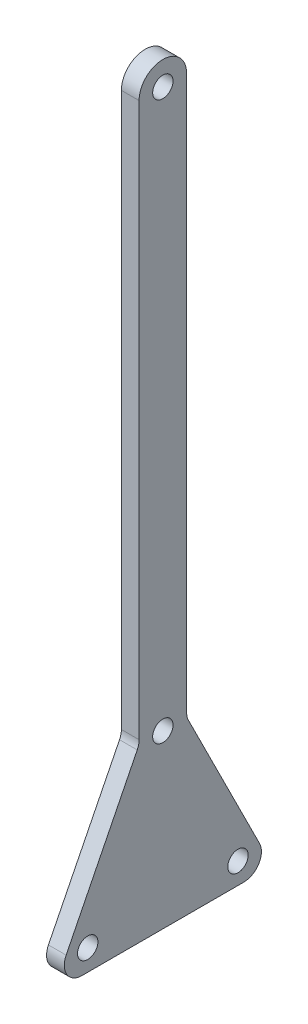
ISO-10303-21;
HEADER;
FILE_DESCRIPTION(('STEP AP214'),'2;1');
FILE_NAME('part.step','',(''),(''),'','','');
FILE_SCHEMA(('AUTOMOTIVE_DESIGN { 1 0 10303 214 1 1 1 1 }'));
ENDSEC;
DATA;
#1=APPLICATION_CONTEXT('core data for automotive mechanical design processes');
#2=APPLICATION_PROTOCOL_DEFINITION('international standard','automotive_design',2000,#1);
#3=PRODUCT_CONTEXT('',#1,'mechanical');
#4=PRODUCT('Part','Part','',(#3));
#5=PRODUCT_RELATED_PRODUCT_CATEGORY('part','',(#4));
#6=PRODUCT_DEFINITION_FORMATION('','',#4);
#7=PRODUCT_DEFINITION_CONTEXT('part definition',#1,'design');
#8=PRODUCT_DEFINITION('design','',#6,#7);
#9=PRODUCT_DEFINITION_SHAPE('','',#8);
#10=(LENGTH_UNIT() NAMED_UNIT(*) SI_UNIT(.MILLI.,.METRE.));
#11=(NAMED_UNIT(*) PLANE_ANGLE_UNIT() SI_UNIT($,.RADIAN.));
#12=(NAMED_UNIT(*) SI_UNIT($,.STERADIAN.) SOLID_ANGLE_UNIT());
#13=UNCERTAINTY_MEASURE_WITH_UNIT(LENGTH_MEASURE(1.E-05),#10,'distance_accuracy_value','');
#14=(GEOMETRIC_REPRESENTATION_CONTEXT(3) GLOBAL_UNCERTAINTY_ASSIGNED_CONTEXT((#13)) GLOBAL_UNIT_ASSIGNED_CONTEXT((#10,
#11,#12)) REPRESENTATION_CONTEXT('',''));
#15=CARTESIAN_POINT('',(0.,0.,0.));
#16=DIRECTION('',(0.,0.,1.));
#17=DIRECTION('',(1.,0.,0.));
#18=AXIS2_PLACEMENT_3D('',#15,#16,#17);
#19=CARTESIAN_POINT('',(3.175,7.09376379885484,-14.1875275977097));
#20=DIRECTION('',(0.,0.447213595499958,-0.894427190999916));
#21=DIRECTION('',(0.,0.894427190999916,0.447213595499958));
#22=AXIS2_PLACEMENT_3D('',#19,#20,#21);
#23=PLANE('',#22);
#24=DIRECTION('',(0.,-0.894427190999916,-0.447213595499958));
#25=VECTOR('',#24,1.);
#26=CARTESIAN_POINT('',(0.,7.09376379885484,-14.1875275977097));
#27=LINE('',#26,#25);
#28=CARTESIAN_POINT('',(0.,26.2790126628495,-4.59490316571237));
#29=VERTEX_POINT('',#28);
#30=CARTESIAN_POINT('',(0.,0.784903165712368,-17.3419579142809));
#31=VERTEX_POINT('',#30);
#32=EDGE_CURVE('E203',#29,#31,#27,.T.);
#33=ORIENTED_EDGE('',*,*,#32,.F.);
#34=DIRECTION('',(-1.,0.,0.));
#35=VECTOR('',#34,1.);
#36=CARTESIAN_POINT('',(3.175,26.2790126628495,-4.59490316571237));
#37=LINE('',#36,#35);
#38=CARTESIAN_POINT('',(3.175,26.2790126628495,-4.59490316571237));
#39=VERTEX_POINT('',#38);
#40=EDGE_CURVE('E257',#29,#39,#37,.F.);
#41=ORIENTED_EDGE('',*,*,#40,.T.);
#42=DIRECTION('',(0.,-0.894427190999916,-0.447213595499958));
#43=VECTOR('',#42,1.);
#44=CARTESIAN_POINT('',(3.175,7.09376379885484,-14.1875275977097));
#45=LINE('',#44,#43);
#46=CARTESIAN_POINT('',(3.175,0.784903165712368,-17.3419579142809));
#47=VERTEX_POINT('',#46);
#48=EDGE_CURVE('E170',#39,#47,#45,.T.);
#49=ORIENTED_EDGE('',*,*,#48,.T.);
#50=DIRECTION('',(-1.,0.,0.));
#51=VECTOR('',#50,1.);
#52=CARTESIAN_POINT('',(3.175,0.784903165712367,-17.3419579142809));
#53=LINE('',#52,#51);
#54=EDGE_CURVE('E253',#47,#31,#53,.T.);
#55=ORIENTED_EDGE('',*,*,#54,.T.);
#56=EDGE_LOOP('',(#33,#41,#49,#55));
#57=FACE_BOUND('',#56,.T.);
#58=ADVANCED_FACE('F42',(#57),#23,.T.);
#59=CARTESIAN_POINT('',(3.175,0.,-4.2597094971371));
#60=DIRECTION('',(0.,0.,-1.));
#61=DIRECTION('',(-1.,0.,0.));
#62=AXIS2_PLACEMENT_3D('',#59,#60,#61);
#63=PLANE('',#62);
#64=DIRECTION('',(0.,-1.,0.));
#65=VECTOR('',#64,1.);
#66=CARTESIAN_POINT('',(3.175,0.,-4.2597094971371));
#67=LINE('',#66,#65);
#68=CARTESIAN_POINT('',(3.175,126.9494,-4.2597094971371));
#69=VERTEX_POINT('',#68);
#70=CARTESIAN_POINT('',(3.175,27.6989158285618,-4.2597094971371));
#71=VERTEX_POINT('',#70);
#72=EDGE_CURVE('E146',#69,#71,#67,.T.);
#73=ORIENTED_EDGE('',*,*,#72,.T.);
#74=DIRECTION('',(-1.,0.,0.));
#75=VECTOR('',#74,1.);
#76=CARTESIAN_POINT('',(0.,27.6989158285618,-4.2597094971371));
#77=LINE('',#76,#75);
#78=CARTESIAN_POINT('',(0.,27.6989158285618,-4.2597094971371));
#79=VERTEX_POINT('',#78);
#80=EDGE_CURVE('E250',#71,#79,#77,.T.);
#81=ORIENTED_EDGE('',*,*,#80,.T.);
#82=DIRECTION('',(0.,-1.,0.));
#83=VECTOR('',#82,1.);
#84=CARTESIAN_POINT('',(0.,0.,-4.2597094971371));
#85=LINE('',#84,#83);
#86=CARTESIAN_POINT('',(0.,126.9494,-4.2597094971371));
#87=VERTEX_POINT('',#86);
#88=EDGE_CURVE('E149',#87,#79,#85,.T.);
#89=ORIENTED_EDGE('',*,*,#88,.F.);
#90=DIRECTION('',(-1.,0.,0.));
#91=VECTOR('',#90,1.);
#92=CARTESIAN_POINT('',(3.175,126.9494,-4.2597094971371));
#93=LINE('',#92,#91);
#94=EDGE_CURVE('E141',#69,#87,#93,.T.);
#95=ORIENTED_EDGE('',*,*,#94,.F.);
#96=EDGE_LOOP('',(#73,#81,#89,#95));
#97=FACE_BOUND('',#96,.T.);
#98=ADVANCED_FACE('F143',(#97),#63,.T.);
#99=CARTESIAN_POINT('',(3.175,126.9494,0.));
#100=DIRECTION('',(-1.,0.,0.));
#101=DIRECTION('',(0.,0.,1.));
#102=AXIS2_PLACEMENT_3D('',#99,#100,#101);
#103=CYLINDRICAL_SURFACE('',#102,4.2597094971371);
#104=CARTESIAN_POINT('',(0.,126.9494,0.));
#105=DIRECTION('',(1.,0.,0.));
#106=DIRECTION('',(0.,0.,-1.));
#107=AXIS2_PLACEMENT_3D('',#104,#105,#106);
#108=CIRCLE('',#107,4.2597094971371);
#109=CARTESIAN_POINT('',(0.,126.9494,4.2597094971371));
#110=VERTEX_POINT('',#109);
#111=EDGE_CURVE('E209',#87,#110,#108,.T.);
#112=ORIENTED_EDGE('',*,*,#111,.T.);
#113=DIRECTION('',(-1.,0.,0.));
#114=VECTOR('',#113,1.);
#115=CARTESIAN_POINT('',(3.175,126.9494,4.2597094971371));
#116=LINE('',#115,#114);
#117=CARTESIAN_POINT('',(3.175,126.9494,4.2597094971371));
#118=VERTEX_POINT('',#117);
#119=EDGE_CURVE('E154',#118,#110,#116,.T.);
#120=ORIENTED_EDGE('',*,*,#119,.F.);
#121=CARTESIAN_POINT('',(3.175,126.9494,0.));
#122=DIRECTION('',(1.,0.,0.));
#123=DIRECTION('',(0.,0.,-1.));
#124=AXIS2_PLACEMENT_3D('',#121,#122,#123);
#125=CIRCLE('',#124,4.2597094971371);
#126=EDGE_CURVE('E157',#69,#118,#125,.T.);
#127=ORIENTED_EDGE('',*,*,#126,.F.);
#128=ORIENTED_EDGE('',*,*,#94,.T.);
#129=EDGE_LOOP('',(#112,#120,#127,#128));
#130=FACE_BOUND('',#129,.T.);
#131=ADVANCED_FACE('F158',(#130),#103,.T.);
#132=CARTESIAN_POINT('',(3.175,0.,4.2597094971371));
#133=DIRECTION('',(0.,0.,-1.));
#134=DIRECTION('',(-1.,0.,0.));
#135=AXIS2_PLACEMENT_3D('',#132,#133,#134);
#136=PLANE('',#135);
#137=DIRECTION('',(0.,-1.,0.));
#138=VECTOR('',#137,1.);
#139=CARTESIAN_POINT('',(0.,0.,4.2597094971371));
#140=LINE('',#139,#138);
#141=CARTESIAN_POINT('',(0.,27.6989158285618,4.2597094971371));
#142=VERTEX_POINT('',#141);
#143=EDGE_CURVE('E212',#110,#142,#140,.T.);
#144=ORIENTED_EDGE('',*,*,#143,.T.);
#145=DIRECTION('',(-1.,0.,0.));
#146=VECTOR('',#145,1.);
#147=CARTESIAN_POINT('',(3.175,27.6989158285618,4.2597094971371));
#148=LINE('',#147,#146);
#149=CARTESIAN_POINT('',(3.175,27.6989158285618,4.2597094971371));
#150=VERTEX_POINT('',#149);
#151=EDGE_CURVE('E247',#142,#150,#148,.F.);
#152=ORIENTED_EDGE('',*,*,#151,.T.);
#153=DIRECTION('',(0.,-1.,0.));
#154=VECTOR('',#153,1.);
#155=CARTESIAN_POINT('',(3.175,0.,4.2597094971371));
#156=LINE('',#155,#154);
#157=EDGE_CURVE('E163',#118,#150,#156,.T.);
#158=ORIENTED_EDGE('',*,*,#157,.F.);
#159=ORIENTED_EDGE('',*,*,#119,.T.);
#160=EDGE_LOOP('',(#144,#152,#158,#159));
#161=FACE_BOUND('',#160,.T.);
#162=ADVANCED_FACE('F312',(#161),#136,.F.);
#163=CARTESIAN_POINT('',(3.175,7.09376379885484,14.1875275977097));
#164=DIRECTION('',(0.,0.447213595499958,0.894427190999916));
#165=DIRECTION('',(0.,-0.894427190999916,0.447213595499958));
#166=AXIS2_PLACEMENT_3D('',#163,#164,#165);
#167=PLANE('',#166);
#168=DIRECTION('',(0.,0.894427190999916,-0.447213595499958));
#169=VECTOR('',#168,1.);
#170=CARTESIAN_POINT('',(3.175,7.09376379885484,14.1875275977097));
#171=LINE('',#170,#169);
#172=CARTESIAN_POINT('',(3.175,0.784903165712362,17.3419579142809));
#173=VERTEX_POINT('',#172);
#174=CARTESIAN_POINT('',(3.175,26.2790126628494,4.59490316571237));
#175=VERTEX_POINT('',#174);
#176=EDGE_CURVE('E181',#173,#175,#171,.T.);
#177=ORIENTED_EDGE('',*,*,#176,.T.);
#178=DIRECTION('',(-1.,0.,0.));
#179=VECTOR('',#178,1.);
#180=CARTESIAN_POINT('',(3.175,26.2790126628494,4.59490316571237));
#181=LINE('',#180,#179);
#182=CARTESIAN_POINT('',(0.,26.2790126628494,4.59490316571237));
#183=VERTEX_POINT('',#182);
#184=EDGE_CURVE('E243',#175,#183,#181,.T.);
#185=ORIENTED_EDGE('',*,*,#184,.T.);
#186=DIRECTION('',(0.,0.894427190999916,-0.447213595499958));
#187=VECTOR('',#186,1.);
#188=CARTESIAN_POINT('',(0.,7.09376379885484,14.1875275977097));
#189=LINE('',#188,#187);
#190=CARTESIAN_POINT('',(0.,0.784903165712362,17.3419579142809));
#191=VERTEX_POINT('',#190);
#192=EDGE_CURVE('E216',#191,#183,#189,.T.);
#193=ORIENTED_EDGE('',*,*,#192,.F.);
#194=DIRECTION('',(-1.,0.,0.));
#195=VECTOR('',#194,1.);
#196=CARTESIAN_POINT('',(3.175,0.784903165712362,17.3419579142809));
#197=LINE('',#196,#195);
#198=EDGE_CURVE('E153',#191,#173,#197,.F.);
#199=ORIENTED_EDGE('',*,*,#198,.T.);
#200=EDGE_LOOP('',(#177,#185,#193,#199));
#201=FACE_BOUND('',#200,.T.);
#202=ADVANCED_FACE('F315',(#201),#167,.T.);
#203=CARTESIAN_POINT('',(3.175,26.9494,0.));
#204=DIRECTION('',(-1.,0.,0.));
#205=DIRECTION('',(0.,0.,1.));
#206=AXIS2_PLACEMENT_3D('',#203,#204,#205);
#207=CYLINDRICAL_SURFACE('',#206,1.8288);
#208=CARTESIAN_POINT('',(3.175,26.9494,0.));
#209=DIRECTION('',(1.,0.,0.));
#210=DIRECTION('',(0.,0.,-1.));
#211=AXIS2_PLACEMENT_3D('',#208,#209,#210);
#212=CIRCLE('',#211,1.8288);
#213=CARTESIAN_POINT('',(3.175,26.9494,-1.8288));
#214=VERTEX_POINT('',#213);
#215=EDGE_CURVE('E196',#214,#214,#212,.T.);
#216=ORIENTED_EDGE('',*,*,#215,.T.);
#217=EDGE_LOOP('',(#216));
#218=FACE_BOUND('',#217,.T.);
#219=CARTESIAN_POINT('',(0.,26.9494,0.));
#220=DIRECTION('',(1.,0.,0.));
#221=DIRECTION('',(0.,0.,-1.));
#222=AXIS2_PLACEMENT_3D('',#219,#220,#221);
#223=CIRCLE('',#222,1.8288);
#224=CARTESIAN_POINT('',(0.,26.9494,-1.8288));
#225=VERTEX_POINT('',#224);
#226=EDGE_CURVE('E232',#225,#225,#223,.T.);
#227=ORIENTED_EDGE('',*,*,#226,.F.);
#228=EDGE_LOOP('',(#227));
#229=FACE_BOUND('',#228,.T.);
#230=ADVANCED_FACE('F319',(#218,#229),#207,.F.);
#231=CARTESIAN_POINT('',(3.175,0.,13.4747));
#232=DIRECTION('',(-1.,0.,0.));
#233=DIRECTION('',(0.,0.,1.));
#234=AXIS2_PLACEMENT_3D('',#231,#232,#233);
#235=CYLINDRICAL_SURFACE('',#234,1.8288);
#236=CARTESIAN_POINT('',(3.175,0.,13.4747));
#237=DIRECTION('',(1.,0.,0.));
#238=DIRECTION('',(0.,0.,-1.));
#239=AXIS2_PLACEMENT_3D('',#236,#237,#238);
#240=CIRCLE('',#239,1.8288);
#241=CARTESIAN_POINT('',(3.175,0.,11.6459));
#242=VERTEX_POINT('',#241);
#243=EDGE_CURVE('E192',#242,#242,#240,.T.);
#244=ORIENTED_EDGE('',*,*,#243,.T.);
#245=EDGE_LOOP('',(#244));
#246=FACE_BOUND('',#245,.T.);
#247=CARTESIAN_POINT('',(0.,0.,13.4747));
#248=DIRECTION('',(1.,0.,0.));
#249=DIRECTION('',(0.,0.,-1.));
#250=AXIS2_PLACEMENT_3D('',#247,#248,#249);
#251=CIRCLE('',#250,1.8288);
#252=CARTESIAN_POINT('',(0.,0.,11.6459));
#253=VERTEX_POINT('',#252);
#254=EDGE_CURVE('E228',#253,#253,#251,.T.);
#255=ORIENTED_EDGE('',*,*,#254,.F.);
#256=EDGE_LOOP('',(#255));
#257=FACE_BOUND('',#256,.T.);
#258=ADVANCED_FACE('F328',(#246,#257),#235,.F.);
#259=CARTESIAN_POINT('',(3.175,0.,-13.4747));
#260=DIRECTION('',(-1.,0.,0.));
#261=DIRECTION('',(0.,0.,1.));
#262=AXIS2_PLACEMENT_3D('',#259,#260,#261);
#263=CYLINDRICAL_SURFACE('',#262,1.8288);
#264=CARTESIAN_POINT('',(3.175,0.,-13.4747));
#265=DIRECTION('',(1.,0.,0.));
#266=DIRECTION('',(0.,0.,-1.));
#267=AXIS2_PLACEMENT_3D('',#264,#265,#266);
#268=CIRCLE('',#267,1.8288);
#269=CARTESIAN_POINT('',(3.175,0.,-15.3035));
#270=VERTEX_POINT('',#269);
#271=EDGE_CURVE('E188',#270,#270,#268,.T.);
#272=ORIENTED_EDGE('',*,*,#271,.T.);
#273=EDGE_LOOP('',(#272));
#274=FACE_BOUND('',#273,.T.);
#275=CARTESIAN_POINT('',(0.,0.,-13.4747));
#276=DIRECTION('',(1.,0.,0.));
#277=DIRECTION('',(0.,0.,-1.));
#278=AXIS2_PLACEMENT_3D('',#275,#276,#277);
#279=CIRCLE('',#278,1.8288);
#280=CARTESIAN_POINT('',(0.,0.,-15.3035));
#281=VERTEX_POINT('',#280);
#282=EDGE_CURVE('E224',#281,#281,#279,.T.);
#283=ORIENTED_EDGE('',*,*,#282,.F.);
#284=EDGE_LOOP('',(#283));
#285=FACE_BOUND('',#284,.T.);
#286=ADVANCED_FACE('F325',(#274,#285),#263,.F.);
#287=CARTESIAN_POINT('',(3.175,-3.81,0.));
#288=DIRECTION('',(0.,-1.,0.));
#289=DIRECTION('',(0.,0.,-1.));
#290=AXIS2_PLACEMENT_3D('',#287,#288,#289);
#291=PLANE('',#290);
#292=DIRECTION('',(0.,0.,1.));
#293=VECTOR('',#292,1.);
#294=CARTESIAN_POINT('',(0.,-3.81,0.));
#295=LINE('',#294,#293);
#296=CARTESIAN_POINT('',(0.,-3.81,-14.5021515828562));
#297=VERTEX_POINT('',#296);
#298=CARTESIAN_POINT('',(0.,-3.81,14.5021515828562));
#299=VERTEX_POINT('',#298);
#300=EDGE_CURVE('E220',#297,#299,#295,.T.);
#301=ORIENTED_EDGE('',*,*,#300,.F.);
#302=DIRECTION('',(-1.,0.,0.));
#303=VECTOR('',#302,1.);
#304=CARTESIAN_POINT('',(3.175,-3.81,-14.5021515828562));
#305=LINE('',#304,#303);
#306=CARTESIAN_POINT('',(3.175,-3.81,-14.5021515828562));
#307=VERTEX_POINT('',#306);
#308=EDGE_CURVE('E70',#297,#307,#305,.F.);
#309=ORIENTED_EDGE('',*,*,#308,.T.);
#310=DIRECTION('',(0.,0.,1.));
#311=VECTOR('',#310,1.);
#312=CARTESIAN_POINT('',(3.175,-3.81,0.));
#313=LINE('',#312,#311);
#314=CARTESIAN_POINT('',(3.175,-3.81,14.5021515828562));
#315=VERTEX_POINT('',#314);
#316=EDGE_CURVE('E185',#307,#315,#313,.T.);
#317=ORIENTED_EDGE('',*,*,#316,.T.);
#318=DIRECTION('',(-1.,0.,0.));
#319=VECTOR('',#318,1.);
#320=CARTESIAN_POINT('',(3.175,-3.81,14.5021515828562));
#321=LINE('',#320,#319);
#322=EDGE_CURVE('E266',#315,#299,#321,.T.);
#323=ORIENTED_EDGE('',*,*,#322,.T.);
#324=EDGE_LOOP('',(#301,#309,#317,#323));
#325=FACE_BOUND('',#324,.T.);
#326=ADVANCED_FACE('F321',(#325),#291,.T.);
#327=CARTESIAN_POINT('',(3.175,126.9494,0.));
#328=DIRECTION('',(-1.,0.,0.));
#329=DIRECTION('',(0.,0.,1.));
#330=AXIS2_PLACEMENT_3D('',#327,#328,#329);
#331=CYLINDRICAL_SURFACE('',#330,1.8288);
#332=CARTESIAN_POINT('',(3.175,126.9494,0.));
#333=DIRECTION('',(1.,0.,0.));
#334=DIRECTION('',(0.,0.,-1.));
#335=AXIS2_PLACEMENT_3D('',#332,#333,#334);
#336=CIRCLE('',#335,1.8288);
#337=CARTESIAN_POINT('',(3.175,126.9494,-1.8288));
#338=VERTEX_POINT('',#337);
#339=EDGE_CURVE('E199',#338,#338,#336,.T.);
#340=ORIENTED_EDGE('',*,*,#339,.T.);
#341=EDGE_LOOP('',(#340));
#342=FACE_BOUND('',#341,.T.);
#343=CARTESIAN_POINT('',(0.,126.9494,0.));
#344=DIRECTION('',(1.,0.,0.));
#345=DIRECTION('',(0.,0.,-1.));
#346=AXIS2_PLACEMENT_3D('',#343,#344,#345);
#347=CIRCLE('',#346,1.8288);
#348=CARTESIAN_POINT('',(0.,126.9494,-1.8288));
#349=VERTEX_POINT('',#348);
#350=EDGE_CURVE('E176',#349,#349,#347,.T.);
#351=ORIENTED_EDGE('',*,*,#350,.F.);
#352=EDGE_LOOP('',(#351));
#353=FACE_BOUND('',#352,.T.);
#354=ADVANCED_FACE('F324',(#342,#353),#331,.F.);
#355=CARTESIAN_POINT('',(3.175,0.,0.));
#356=DIRECTION('',(1.,0.,0.));
#357=DIRECTION('',(0.,0.,-1.));
#358=AXIS2_PLACEMENT_3D('',#355,#356,#357);
#359=PLANE('',#358);
#360=ORIENTED_EDGE('',*,*,#316,.F.);
#361=CARTESIAN_POINT('',(3.175,-0.635,-14.5021515828562));
#362=DIRECTION('',(1.,0.,0.));
#363=DIRECTION('',(0.,0.,-1.));
#364=AXIS2_PLACEMENT_3D('',#361,#362,#363);
#365=CIRCLE('',#364,3.175);
#366=EDGE_CURVE('E274',#307,#47,#365,.T.);
#367=ORIENTED_EDGE('',*,*,#366,.T.);
#368=ORIENTED_EDGE('',*,*,#48,.F.);
#369=CARTESIAN_POINT('',(3.175,27.6989158285618,-7.4347094971371));
#370=DIRECTION('',(1.,0.,0.));
#371=DIRECTION('',(0.,0.,-1.));
#372=AXIS2_PLACEMENT_3D('',#369,#370,#371);
#373=CIRCLE('',#372,3.175);
#374=EDGE_CURVE('E11',#39,#71,#373,.F.);
#375=ORIENTED_EDGE('',*,*,#374,.T.);
#376=ORIENTED_EDGE('',*,*,#72,.F.);
#377=ORIENTED_EDGE('',*,*,#126,.T.);
#378=ORIENTED_EDGE('',*,*,#157,.T.);
#379=CARTESIAN_POINT('',(3.175,27.6989158285618,7.4347094971371));
#380=DIRECTION('',(1.,0.,0.));
#381=DIRECTION('',(0.,0.,-1.));
#382=AXIS2_PLACEMENT_3D('',#379,#380,#381);
#383=CIRCLE('',#382,3.175);
#384=EDGE_CURVE('E280',#150,#175,#383,.F.);
#385=ORIENTED_EDGE('',*,*,#384,.T.);
#386=ORIENTED_EDGE('',*,*,#176,.F.);
#387=CARTESIAN_POINT('',(3.175,-0.635000000000004,14.5021515828562));
#388=DIRECTION('',(1.,0.,0.));
#389=DIRECTION('',(0.,0.,-1.));
#390=AXIS2_PLACEMENT_3D('',#387,#388,#389);
#391=CIRCLE('',#390,3.175);
#392=EDGE_CURVE('E61',#173,#315,#391,.T.);
#393=ORIENTED_EDGE('',*,*,#392,.T.);
#394=EDGE_LOOP('',(#360,#367,#368,#375,#376,#377,#378,#385,#386,#393));
#395=FACE_BOUND('',#394,.T.);
#396=ORIENTED_EDGE('',*,*,#271,.F.);
#397=EDGE_LOOP('',(#396));
#398=FACE_BOUND('',#397,.T.);
#399=ORIENTED_EDGE('',*,*,#243,.F.);
#400=EDGE_LOOP('',(#399));
#401=FACE_BOUND('',#400,.T.);
#402=ORIENTED_EDGE('',*,*,#215,.F.);
#403=EDGE_LOOP('',(#402));
#404=FACE_BOUND('',#403,.T.);
#405=ORIENTED_EDGE('',*,*,#339,.F.);
#406=EDGE_LOOP('',(#405));
#407=FACE_BOUND('',#406,.T.);
#408=ADVANCED_FACE('F165',(#395,#398,#401,#404,#407),#359,.T.);
#409=CARTESIAN_POINT('',(0.,0.,0.));
#410=DIRECTION('',(1.,0.,0.));
#411=DIRECTION('',(0.,0.,-1.));
#412=AXIS2_PLACEMENT_3D('',#409,#410,#411);
#413=PLANE('',#412);
#414=ORIENTED_EDGE('',*,*,#32,.T.);
#415=CARTESIAN_POINT('',(0.,-0.635,-14.5021515828562));
#416=DIRECTION('',(1.,0.,0.));
#417=DIRECTION('',(0.,0.,-1.));
#418=AXIS2_PLACEMENT_3D('',#415,#416,#417);
#419=CIRCLE('',#418,3.175);
#420=EDGE_CURVE('E263',#31,#297,#419,.F.);
#421=ORIENTED_EDGE('',*,*,#420,.T.);
#422=ORIENTED_EDGE('',*,*,#300,.T.);
#423=CARTESIAN_POINT('',(0.,-0.635000000000004,14.5021515828562));
#424=DIRECTION('',(1.,0.,0.));
#425=DIRECTION('',(0.,0.,-1.));
#426=AXIS2_PLACEMENT_3D('',#423,#424,#425);
#427=CIRCLE('',#426,3.175);
#428=EDGE_CURVE('E260',#299,#191,#427,.F.);
#429=ORIENTED_EDGE('',*,*,#428,.T.);
#430=ORIENTED_EDGE('',*,*,#192,.T.);
#431=CARTESIAN_POINT('',(0.,27.6989158285618,7.4347094971371));
#432=DIRECTION('',(1.,0.,0.));
#433=DIRECTION('',(0.,0.,-1.));
#434=AXIS2_PLACEMENT_3D('',#431,#432,#433);
#435=CIRCLE('',#434,3.175);
#436=EDGE_CURVE('E277',#183,#142,#435,.T.);
#437=ORIENTED_EDGE('',*,*,#436,.T.);
#438=ORIENTED_EDGE('',*,*,#143,.F.);
#439=ORIENTED_EDGE('',*,*,#111,.F.);
#440=ORIENTED_EDGE('',*,*,#88,.T.);
#441=CARTESIAN_POINT('',(0.,27.6989158285618,-7.4347094971371));
#442=DIRECTION('',(1.,0.,0.));
#443=DIRECTION('',(0.,0.,-1.));
#444=AXIS2_PLACEMENT_3D('',#441,#442,#443);
#445=CIRCLE('',#444,3.175);
#446=EDGE_CURVE('E51',#79,#29,#445,.T.);
#447=ORIENTED_EDGE('',*,*,#446,.T.);
#448=EDGE_LOOP('',(#414,#421,#422,#429,#430,#437,#438,#439,#440,#447));
#449=FACE_BOUND('',#448,.T.);
#450=ORIENTED_EDGE('',*,*,#282,.T.);
#451=EDGE_LOOP('',(#450));
#452=FACE_BOUND('',#451,.T.);
#453=ORIENTED_EDGE('',*,*,#254,.T.);
#454=EDGE_LOOP('',(#453));
#455=FACE_BOUND('',#454,.T.);
#456=ORIENTED_EDGE('',*,*,#226,.T.);
#457=EDGE_LOOP('',(#456));
#458=FACE_BOUND('',#457,.T.);
#459=ORIENTED_EDGE('',*,*,#350,.T.);
#460=EDGE_LOOP('',(#459));
#461=FACE_BOUND('',#460,.T.);
#462=ADVANCED_FACE('F284',(#449,#452,#455,#458,#461),#413,.F.);
#463=CARTESIAN_POINT('',(3.175,27.6989158285618,7.4347094971371));
#464=DIRECTION('',(-1.,0.,0.));
#465=DIRECTION('',(0.,0.,1.));
#466=AXIS2_PLACEMENT_3D('',#463,#464,#465);
#467=CYLINDRICAL_SURFACE('',#466,3.175);
#468=ORIENTED_EDGE('',*,*,#384,.F.);
#469=ORIENTED_EDGE('',*,*,#151,.F.);
#470=ORIENTED_EDGE('',*,*,#436,.F.);
#471=ORIENTED_EDGE('',*,*,#184,.F.);
#472=EDGE_LOOP('',(#468,#469,#470,#471));
#473=FACE_BOUND('',#472,.T.);
#474=ADVANCED_FACE('F293',(#473),#467,.F.);
#475=CARTESIAN_POINT('',(3.175,27.6989158285618,-7.4347094971371));
#476=DIRECTION('',(1.,0.,0.));
#477=DIRECTION('',(0.,0.,-1.));
#478=AXIS2_PLACEMENT_3D('',#475,#476,#477);
#479=CYLINDRICAL_SURFACE('',#478,3.175);
#480=ORIENTED_EDGE('',*,*,#374,.F.);
#481=ORIENTED_EDGE('',*,*,#40,.F.);
#482=ORIENTED_EDGE('',*,*,#446,.F.);
#483=ORIENTED_EDGE('',*,*,#80,.F.);
#484=EDGE_LOOP('',(#480,#481,#482,#483));
#485=FACE_BOUND('',#484,.T.);
#486=ADVANCED_FACE('F290',(#485),#479,.F.);
#487=CARTESIAN_POINT('',(3.175,-0.635,-14.5021515828562));
#488=DIRECTION('',(-1.,0.,0.));
#489=DIRECTION('',(0.,0.,1.));
#490=AXIS2_PLACEMENT_3D('',#487,#488,#489);
#491=CYLINDRICAL_SURFACE('',#490,3.175);
#492=ORIENTED_EDGE('',*,*,#366,.F.);
#493=ORIENTED_EDGE('',*,*,#308,.F.);
#494=ORIENTED_EDGE('',*,*,#420,.F.);
#495=ORIENTED_EDGE('',*,*,#54,.F.);
#496=EDGE_LOOP('',(#492,#493,#494,#495));
#497=FACE_BOUND('',#496,.T.);
#498=ADVANCED_FACE('F292',(#497),#491,.T.);
#499=CARTESIAN_POINT('',(3.175,-0.635000000000004,14.5021515828562));
#500=DIRECTION('',(-1.,0.,0.));
#501=DIRECTION('',(0.,0.,1.));
#502=AXIS2_PLACEMENT_3D('',#499,#500,#501);
#503=CYLINDRICAL_SURFACE('',#502,3.175);
#504=ORIENTED_EDGE('',*,*,#392,.F.);
#505=ORIENTED_EDGE('',*,*,#198,.F.);
#506=ORIENTED_EDGE('',*,*,#428,.F.);
#507=ORIENTED_EDGE('',*,*,#322,.F.);
#508=EDGE_LOOP('',(#504,#505,#506,#507));
#509=FACE_BOUND('',#508,.T.);
#510=ADVANCED_FACE('F44',(#509),#503,.T.);
#511=CLOSED_SHELL('',(#58,#98,#131,#162,#202,#230,#258,#286,#326,#354,#408,#462,#474,#486,#498,#510));
#512=MANIFOLD_SOLID_BREP('B2',#511);
#513=ADVANCED_BREP_SHAPE_REPRESENTATION('',(#18,#512),#14);
#514=SHAPE_DEFINITION_REPRESENTATION(#9,#513);
ENDSEC;
END-ISO-10303-21;
